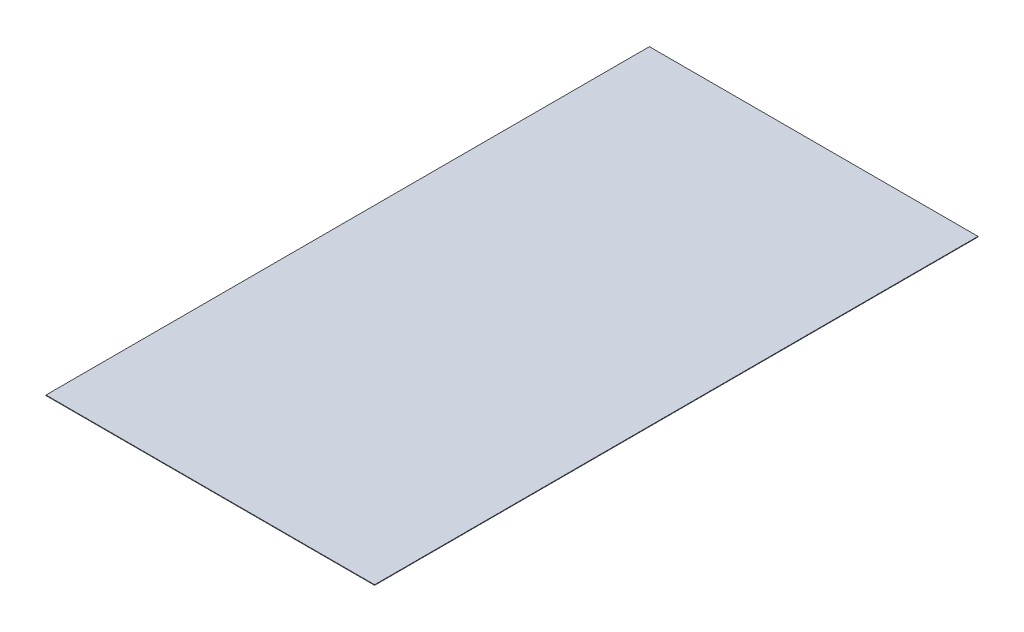
ISO-10303-21;
HEADER;
FILE_DESCRIPTION(('STEP AP214'),'2;1');
FILE_NAME('part.step','',(''),(''),'','','');
FILE_SCHEMA(('AUTOMOTIVE_DESIGN { 1 0 10303 214 1 1 1 1 }'));
ENDSEC;
DATA;
#1=APPLICATION_CONTEXT('core data for automotive mechanical design processes');
#2=APPLICATION_PROTOCOL_DEFINITION('international standard','automotive_design',2000,#1);
#3=PRODUCT_CONTEXT('',#1,'mechanical');
#4=PRODUCT('Part','Part','',(#3));
#5=PRODUCT_RELATED_PRODUCT_CATEGORY('part','',(#4));
#6=PRODUCT_DEFINITION_FORMATION('','',#4);
#7=PRODUCT_DEFINITION_CONTEXT('part definition',#1,'design');
#8=PRODUCT_DEFINITION('design','',#6,#7);
#9=PRODUCT_DEFINITION_SHAPE('','',#8);
#10=(LENGTH_UNIT() NAMED_UNIT(*) SI_UNIT(.MILLI.,.METRE.));
#11=(NAMED_UNIT(*) PLANE_ANGLE_UNIT() SI_UNIT($,.RADIAN.));
#12=(NAMED_UNIT(*) SI_UNIT($,.STERADIAN.) SOLID_ANGLE_UNIT());
#13=UNCERTAINTY_MEASURE_WITH_UNIT(LENGTH_MEASURE(1.E-05),#10,'distance_accuracy_value','');
#14=(GEOMETRIC_REPRESENTATION_CONTEXT(3) GLOBAL_UNCERTAINTY_ASSIGNED_CONTEXT((#13)) GLOBAL_UNIT_ASSIGNED_CONTEXT((#10,
#11,#12)) REPRESENTATION_CONTEXT('',''));
#15=CARTESIAN_POINT('',(0.,0.,0.));
#16=DIRECTION('',(0.,0.,1.));
#17=DIRECTION('',(1.,0.,0.));
#18=AXIS2_PLACEMENT_3D('',#15,#16,#17);
#19=CARTESIAN_POINT('',(74.7851565724886,1.,1042.14185483652));
#20=DIRECTION('',(-1.,0.,0.));
#21=DIRECTION('',(0.,0.,1.));
#22=AXIS2_PLACEMENT_3D('',#19,#20,#21);
#23=PLANE('',#22);
#24=DIRECTION('',(0.,0.,-1.));
#25=VECTOR('',#24,1.);
#26=CARTESIAN_POINT('',(74.7851565724886,0.,1042.14185483652));
#27=LINE('',#26,#25);
#28=CARTESIAN_POINT('',(74.7851565724886,0.,1042.14185483652));
#29=VERTEX_POINT('',#28);
#30=CARTESIAN_POINT('',(74.7851565724886,0.,-55.8581451634836));
#31=VERTEX_POINT('',#30);
#32=EDGE_CURVE('E96',#29,#31,#27,.T.);
#33=ORIENTED_EDGE('',*,*,#32,.T.);
#34=DIRECTION('',(0.,-1.,0.));
#35=VECTOR('',#34,1.);
#36=CARTESIAN_POINT('',(74.7851565724886,1.,-55.8581451634836));
#37=LINE('',#36,#35);
#38=CARTESIAN_POINT('',(74.7851565724886,1.,-55.8581451634836));
#39=VERTEX_POINT('',#38);
#40=EDGE_CURVE('E11',#39,#31,#37,.T.);
#41=ORIENTED_EDGE('',*,*,#40,.F.);
#42=DIRECTION('',(0.,0.,-1.));
#43=VECTOR('',#42,1.);
#44=CARTESIAN_POINT('',(74.7851565724886,1.,1042.14185483652));
#45=LINE('',#44,#43);
#46=CARTESIAN_POINT('',(74.7851565724886,1.,1042.14185483652));
#47=VERTEX_POINT('',#46);
#48=EDGE_CURVE('E84',#47,#39,#45,.T.);
#49=ORIENTED_EDGE('',*,*,#48,.F.);
#50=DIRECTION('',(0.,-1.,0.));
#51=VECTOR('',#50,1.);
#52=CARTESIAN_POINT('',(74.7851565724886,1.,1042.14185483652));
#53=LINE('',#52,#51);
#54=EDGE_CURVE('E92',#47,#29,#53,.T.);
#55=ORIENTED_EDGE('',*,*,#54,.T.);
#56=EDGE_LOOP('',(#33,#41,#49,#55));
#57=FACE_BOUND('',#56,.T.);
#58=ADVANCED_FACE('F33',(#57),#23,.F.);
#59=CARTESIAN_POINT('',(74.7851565724886,1.,-55.8581451634836));
#60=DIRECTION('',(0.,0.,1.));
#61=DIRECTION('',(1.,0.,0.));
#62=AXIS2_PLACEMENT_3D('',#59,#60,#61);
#63=PLANE('',#62);
#64=DIRECTION('',(-1.,0.,0.));
#65=VECTOR('',#64,1.);
#66=CARTESIAN_POINT('',(74.7851565724886,0.,-55.8581451634836));
#67=LINE('',#66,#65);
#68=CARTESIAN_POINT('',(-523.214843427511,0.,-55.8581451634836));
#69=VERTEX_POINT('',#68);
#70=EDGE_CURVE('E88',#31,#69,#67,.T.);
#71=ORIENTED_EDGE('',*,*,#70,.T.);
#72=DIRECTION('',(0.,-1.,0.));
#73=VECTOR('',#72,1.);
#74=CARTESIAN_POINT('',(-523.214843427511,1.,-55.8581451634836));
#75=LINE('',#74,#73);
#76=CARTESIAN_POINT('',(-523.214843427511,1.,-55.8581451634836));
#77=VERTEX_POINT('',#76);
#78=EDGE_CURVE('E41',#77,#69,#75,.T.);
#79=ORIENTED_EDGE('',*,*,#78,.F.);
#80=DIRECTION('',(-1.,0.,0.));
#81=VECTOR('',#80,1.);
#82=CARTESIAN_POINT('',(74.7851565724886,1.,-55.8581451634836));
#83=LINE('',#82,#81);
#84=EDGE_CURVE('E79',#39,#77,#83,.T.);
#85=ORIENTED_EDGE('',*,*,#84,.F.);
#86=ORIENTED_EDGE('',*,*,#40,.T.);
#87=EDGE_LOOP('',(#71,#79,#85,#86));
#88=FACE_BOUND('',#87,.T.);
#89=ADVANCED_FACE('F87',(#88),#63,.F.);
#90=CARTESIAN_POINT('',(-523.214843427511,1.,1042.14185483652));
#91=DIRECTION('',(1.,0.,0.));
#92=DIRECTION('',(0.,0.,-1.));
#93=AXIS2_PLACEMENT_3D('',#90,#91,#92);
#94=PLANE('',#93);
#95=DIRECTION('',(0.,0.,1.));
#96=VECTOR('',#95,1.);
#97=CARTESIAN_POINT('',(-523.214843427511,0.,1042.14185483652));
#98=LINE('',#97,#96);
#99=CARTESIAN_POINT('',(-523.214843427511,0.,1042.14185483652));
#100=VERTEX_POINT('',#99);
#101=EDGE_CURVE('E66',#69,#100,#98,.T.);
#102=ORIENTED_EDGE('',*,*,#101,.T.);
#103=DIRECTION('',(0.,-1.,0.));
#104=VECTOR('',#103,1.);
#105=CARTESIAN_POINT('',(-523.214843427511,1.,1042.14185483652));
#106=LINE('',#105,#104);
#107=CARTESIAN_POINT('',(-523.214843427511,1.,1042.14185483652));
#108=VERTEX_POINT('',#107);
#109=EDGE_CURVE('E89',#108,#100,#106,.T.);
#110=ORIENTED_EDGE('',*,*,#109,.F.);
#111=DIRECTION('',(0.,0.,1.));
#112=VECTOR('',#111,1.);
#113=CARTESIAN_POINT('',(-523.214843427511,1.,1042.14185483652));
#114=LINE('',#113,#112);
#115=EDGE_CURVE('E82',#77,#108,#114,.T.);
#116=ORIENTED_EDGE('',*,*,#115,.F.);
#117=ORIENTED_EDGE('',*,*,#78,.T.);
#118=EDGE_LOOP('',(#102,#110,#116,#117));
#119=FACE_BOUND('',#118,.T.);
#120=ADVANCED_FACE('F90',(#119),#94,.F.);
#121=CARTESIAN_POINT('',(74.7851565724886,1.,1042.14185483652));
#122=DIRECTION('',(0.,0.,-1.));
#123=DIRECTION('',(-1.,0.,0.));
#124=AXIS2_PLACEMENT_3D('',#121,#122,#123);
#125=PLANE('',#124);
#126=DIRECTION('',(1.,0.,0.));
#127=VECTOR('',#126,1.);
#128=CARTESIAN_POINT('',(74.7851565724886,0.,1042.14185483652));
#129=LINE('',#128,#127);
#130=EDGE_CURVE('E72',#100,#29,#129,.T.);
#131=ORIENTED_EDGE('',*,*,#130,.T.);
#132=ORIENTED_EDGE('',*,*,#54,.F.);
#133=DIRECTION('',(1.,0.,0.));
#134=VECTOR('',#133,1.);
#135=CARTESIAN_POINT('',(74.7851565724886,1.,1042.14185483652));
#136=LINE('',#135,#134);
#137=EDGE_CURVE('E49',#108,#47,#136,.T.);
#138=ORIENTED_EDGE('',*,*,#137,.F.);
#139=ORIENTED_EDGE('',*,*,#109,.T.);
#140=EDGE_LOOP('',(#131,#132,#138,#139));
#141=FACE_BOUND('',#140,.T.);
#142=ADVANCED_FACE('F103',(#141),#125,.F.);
#143=CARTESIAN_POINT('',(0.,1.,0.));
#144=DIRECTION('',(0.,1.,0.));
#145=DIRECTION('',(0.,0.,1.));
#146=AXIS2_PLACEMENT_3D('',#143,#144,#145);
#147=PLANE('',#146);
#148=ORIENTED_EDGE('',*,*,#48,.T.);
#149=ORIENTED_EDGE('',*,*,#84,.T.);
#150=ORIENTED_EDGE('',*,*,#115,.T.);
#151=ORIENTED_EDGE('',*,*,#137,.T.);
#152=EDGE_LOOP('',(#148,#149,#150,#151));
#153=FACE_BOUND('',#152,.T.);
#154=ADVANCED_FACE('F80',(#153),#147,.T.);
#155=CARTESIAN_POINT('',(0.,0.,0.));
#156=DIRECTION('',(0.,1.,0.));
#157=DIRECTION('',(0.,0.,1.));
#158=AXIS2_PLACEMENT_3D('',#155,#156,#157);
#159=PLANE('',#158);
#160=ORIENTED_EDGE('',*,*,#32,.F.);
#161=ORIENTED_EDGE('',*,*,#130,.F.);
#162=ORIENTED_EDGE('',*,*,#101,.F.);
#163=ORIENTED_EDGE('',*,*,#70,.F.);
#164=EDGE_LOOP('',(#160,#161,#162,#163));
#165=FACE_BOUND('',#164,.T.);
#166=ADVANCED_FACE('F106',(#165),#159,.F.);
#167=CLOSED_SHELL('',(#58,#89,#120,#142,#154,#166));
#168=MANIFOLD_SOLID_BREP('B2',#167);
#169=ADVANCED_BREP_SHAPE_REPRESENTATION('',(#18,#168),#14);
#170=SHAPE_DEFINITION_REPRESENTATION(#9,#169);
ENDSEC;
END-ISO-10303-21;
